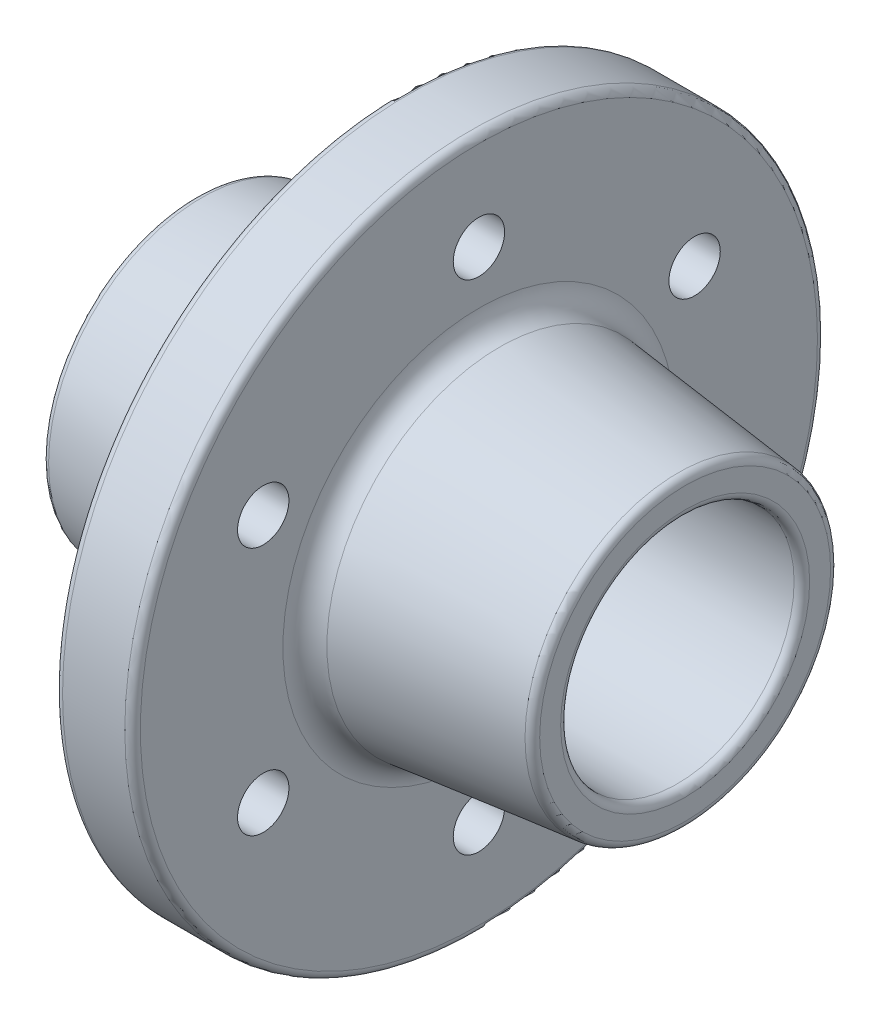
ISO-10303-21;
HEADER;
FILE_DESCRIPTION(('STEP AP214'),'2;1');
FILE_NAME('part.step','',(''),(''),'','','');
FILE_SCHEMA(('AUTOMOTIVE_DESIGN { 1 0 10303 214 1 1 1 1 }'));
ENDSEC;
DATA;
#1=APPLICATION_CONTEXT('core data for automotive mechanical design processes');
#2=APPLICATION_PROTOCOL_DEFINITION('international standard','automotive_design',2000,#1);
#3=PRODUCT_CONTEXT('',#1,'mechanical');
#4=PRODUCT('Part','Part','',(#3));
#5=PRODUCT_RELATED_PRODUCT_CATEGORY('part','',(#4));
#6=PRODUCT_DEFINITION_FORMATION('','',#4);
#7=PRODUCT_DEFINITION_CONTEXT('part definition',#1,'design');
#8=PRODUCT_DEFINITION('design','',#6,#7);
#9=PRODUCT_DEFINITION_SHAPE('','',#8);
#10=(LENGTH_UNIT() NAMED_UNIT(*) SI_UNIT(.MILLI.,.METRE.));
#11=(NAMED_UNIT(*) PLANE_ANGLE_UNIT() SI_UNIT($,.RADIAN.));
#12=(NAMED_UNIT(*) SI_UNIT($,.STERADIAN.) SOLID_ANGLE_UNIT());
#13=UNCERTAINTY_MEASURE_WITH_UNIT(LENGTH_MEASURE(1.E-05),#10,'distance_accuracy_value','');
#14=(GEOMETRIC_REPRESENTATION_CONTEXT(3) GLOBAL_UNCERTAINTY_ASSIGNED_CONTEXT((#13)) GLOBAL_UNIT_ASSIGNED_CONTEXT((#10,
#11,#12)) REPRESENTATION_CONTEXT('',''));
#15=CARTESIAN_POINT('',(0.,0.,0.));
#16=DIRECTION('',(0.,0.,1.));
#17=DIRECTION('',(1.,0.,0.));
#18=AXIS2_PLACEMENT_3D('',#15,#16,#17);
#19=CARTESIAN_POINT('',(0.,0.,0.));
#20=DIRECTION('',(1.,0.,0.));
#21=DIRECTION('',(0.,0.,-1.));
#22=AXIS2_PLACEMENT_3D('',#19,#20,#21);
#23=PLANE('',#22);
#24=CARTESIAN_POINT('',(0.,16.0000000000003,27.7128129211019));
#25=DIRECTION('',(-1.,0.,0.));
#26=DIRECTION('',(0.,0.,1.));
#27=AXIS2_PLACEMENT_3D('',#24,#25,#26);
#28=CIRCLE('',#27,3.29999999999999);
#29=CARTESIAN_POINT('',(0.,16.0000000000003,31.0128129211018));
#30=VERTEX_POINT('',#29);
#31=EDGE_CURVE('E93',#30,#30,#28,.T.);
#32=ORIENTED_EDGE('',*,*,#31,.F.);
#33=EDGE_LOOP('',(#32));
#34=FACE_BOUND('',#33,.T.);
#35=CARTESIAN_POINT('',(0.,-15.9999999999997,27.7128129211022));
#36=DIRECTION('',(-1.,0.,0.));
#37=DIRECTION('',(0.,0.,1.));
#38=AXIS2_PLACEMENT_3D('',#35,#36,#37);
#39=CIRCLE('',#38,3.29999999999999);
#40=CARTESIAN_POINT('',(0.,-15.9999999999997,31.0128129211022));
#41=VERTEX_POINT('',#40);
#42=EDGE_CURVE('E76',#41,#41,#39,.T.);
#43=ORIENTED_EDGE('',*,*,#42,.F.);
#44=EDGE_LOOP('',(#43));
#45=FACE_BOUND('',#44,.T.);
#46=CARTESIAN_POINT('',(0.,15.9999999999999,-27.7128129211021));
#47=DIRECTION('',(-1.,0.,0.));
#48=DIRECTION('',(0.,0.,1.));
#49=AXIS2_PLACEMENT_3D('',#46,#47,#48);
#50=CIRCLE('',#49,3.29999999999999);
#51=CARTESIAN_POINT('',(0.,15.9999999999999,-24.4128129211021));
#52=VERTEX_POINT('',#51);
#53=EDGE_CURVE('E103',#52,#52,#50,.T.);
#54=ORIENTED_EDGE('',*,*,#53,.F.);
#55=EDGE_LOOP('',(#54));
#56=FACE_BOUND('',#55,.T.);
#57=CARTESIAN_POINT('',(0.,32.,0.));
#58=DIRECTION('',(-1.,0.,0.));
#59=DIRECTION('',(0.,0.,1.));
#60=AXIS2_PLACEMENT_3D('',#57,#58,#59);
#61=CIRCLE('',#60,3.29999999999998);
#62=CARTESIAN_POINT('',(0.,32.,3.29999999999998));
#63=VERTEX_POINT('',#62);
#64=EDGE_CURVE('E111',#63,#63,#61,.T.);
#65=ORIENTED_EDGE('',*,*,#64,.F.);
#66=EDGE_LOOP('',(#65));
#67=FACE_BOUND('',#66,.T.);
#68=CARTESIAN_POINT('',(0.,0.,0.));
#69=DIRECTION('',(1.,0.,0.));
#70=DIRECTION('',(0.,0.,-1.));
#71=AXIS2_PLACEMENT_3D('',#68,#69,#70);
#72=CIRCLE('',#71,43.5);
#73=CARTESIAN_POINT('',(0.,0.,-43.5));
#74=VERTEX_POINT('',#73);
#75=EDGE_CURVE('E56',#74,#74,#72,.F.);
#76=ORIENTED_EDGE('',*,*,#75,.T.);
#77=EDGE_LOOP('',(#76));
#78=FACE_BOUND('',#77,.T.);
#79=CARTESIAN_POINT('',(0.,0.,0.));
#80=DIRECTION('',(1.,0.,0.));
#81=DIRECTION('',(0.,0.,-1.));
#82=AXIS2_PLACEMENT_3D('',#79,#80,#81);
#83=CIRCLE('',#82,25.1884399277633);
#84=CARTESIAN_POINT('',(0.,0.,-25.1884399277633));
#85=VERTEX_POINT('',#84);
#86=EDGE_CURVE('E131',#85,#85,#83,.T.);
#87=ORIENTED_EDGE('',*,*,#86,.T.);
#88=EDGE_LOOP('',(#87));
#89=FACE_BOUND('',#88,.T.);
#90=CARTESIAN_POINT('',(0.,-16.0000000000001,-27.712812921102));
#91=DIRECTION('',(-1.,0.,0.));
#92=DIRECTION('',(0.,0.,1.));
#93=AXIS2_PLACEMENT_3D('',#90,#91,#92);
#94=CIRCLE('',#93,3.29999999999999);
#95=CARTESIAN_POINT('',(0.,-16.0000000000001,-24.412812921102));
#96=VERTEX_POINT('',#95);
#97=EDGE_CURVE('E71',#96,#96,#94,.T.);
#98=ORIENTED_EDGE('',*,*,#97,.F.);
#99=EDGE_LOOP('',(#98));
#100=FACE_BOUND('',#99,.T.);
#101=CARTESIAN_POINT('',(0.,-32.,0.));
#102=DIRECTION('',(-1.,0.,0.));
#103=DIRECTION('',(0.,0.,1.));
#104=AXIS2_PLACEMENT_3D('',#101,#102,#103);
#105=CIRCLE('',#104,3.29999999999999);
#106=CARTESIAN_POINT('',(0.,-32.,3.29999999999999));
#107=VERTEX_POINT('',#106);
#108=EDGE_CURVE('E72',#107,#107,#105,.T.);
#109=ORIENTED_EDGE('',*,*,#108,.F.);
#110=EDGE_LOOP('',(#109));
#111=FACE_BOUND('',#110,.T.);
#112=ADVANCED_FACE('F47',(#34,#45,#56,#67,#78,#89,#100,#111),#23,.F.);
#113=CARTESIAN_POINT('',(10.,0.,0.));
#114=DIRECTION('',(-1.,0.,0.));
#115=DIRECTION('',(0.,0.,1.));
#116=AXIS2_PLACEMENT_3D('',#113,#114,#115);
#117=CYLINDRICAL_SURFACE('',#116,44.5);
#118=CARTESIAN_POINT('',(0.999999999999999,0.,0.));
#119=DIRECTION('',(1.,0.,0.));
#120=DIRECTION('',(0.,0.,-1.));
#121=AXIS2_PLACEMENT_3D('',#118,#119,#120);
#122=CIRCLE('',#121,44.5);
#123=CARTESIAN_POINT('',(0.999999999999999,0.,-44.5));
#124=VERTEX_POINT('',#123);
#125=EDGE_CURVE('E64',#124,#124,#122,.T.);
#126=ORIENTED_EDGE('',*,*,#125,.T.);
#127=EDGE_LOOP('',(#126));
#128=FACE_BOUND('',#127,.T.);
#129=CARTESIAN_POINT('',(9.,0.,0.));
#130=DIRECTION('',(1.,0.,0.));
#131=DIRECTION('',(0.,0.,-1.));
#132=AXIS2_PLACEMENT_3D('',#129,#130,#131);
#133=CIRCLE('',#132,44.5);
#134=CARTESIAN_POINT('',(9.,0.,-44.5));
#135=VERTEX_POINT('',#134);
#136=EDGE_CURVE('E167',#135,#135,#133,.F.);
#137=ORIENTED_EDGE('',*,*,#136,.T.);
#138=EDGE_LOOP('',(#137));
#139=FACE_BOUND('',#138,.T.);
#140=ADVANCED_FACE('F176',(#128,#139),#117,.T.);
#141=CARTESIAN_POINT('',(10.,0.,0.));
#142=DIRECTION('',(1.,0.,0.));
#143=DIRECTION('',(0.,0.,-1.));
#144=AXIS2_PLACEMENT_3D('',#141,#142,#143);
#145=PLANE('',#144);
#146=CARTESIAN_POINT('',(10.,16.0000000000003,27.7128129211019));
#147=DIRECTION('',(1.,0.,0.));
#148=DIRECTION('',(0.,0.,-1.));
#149=AXIS2_PLACEMENT_3D('',#146,#147,#148);
#150=CIRCLE('',#149,3.29999999999999);
#151=CARTESIAN_POINT('',(10.,16.0000000000003,24.4128129211019));
#152=VERTEX_POINT('',#151);
#153=EDGE_CURVE('E51',#152,#152,#150,.T.);
#154=ORIENTED_EDGE('',*,*,#153,.F.);
#155=EDGE_LOOP('',(#154));
#156=FACE_BOUND('',#155,.T.);
#157=CARTESIAN_POINT('',(10.,-15.9999999999997,27.7128129211022));
#158=DIRECTION('',(1.,0.,0.));
#159=DIRECTION('',(0.,0.,-1.));
#160=AXIS2_PLACEMENT_3D('',#157,#158,#159);
#161=CIRCLE('',#160,3.29999999999999);
#162=CARTESIAN_POINT('',(10.,-15.9999999999997,24.4128129211022));
#163=VERTEX_POINT('',#162);
#164=EDGE_CURVE('E73',#163,#163,#161,.T.);
#165=ORIENTED_EDGE('',*,*,#164,.F.);
#166=EDGE_LOOP('',(#165));
#167=FACE_BOUND('',#166,.T.);
#168=CARTESIAN_POINT('',(10.,-32.,0.));
#169=DIRECTION('',(1.,0.,0.));
#170=DIRECTION('',(0.,0.,-1.));
#171=AXIS2_PLACEMENT_3D('',#168,#169,#170);
#172=CIRCLE('',#171,3.29999999999999);
#173=CARTESIAN_POINT('',(10.,-32.,-3.29999999999999));
#174=VERTEX_POINT('',#173);
#175=EDGE_CURVE('E68',#174,#174,#172,.T.);
#176=ORIENTED_EDGE('',*,*,#175,.F.);
#177=EDGE_LOOP('',(#176));
#178=FACE_BOUND('',#177,.T.);
#179=CARTESIAN_POINT('',(10.,-16.0000000000001,-27.712812921102));
#180=DIRECTION('',(1.,0.,0.));
#181=DIRECTION('',(0.,0.,-1.));
#182=AXIS2_PLACEMENT_3D('',#179,#180,#181);
#183=CIRCLE('',#182,3.29999999999999);
#184=CARTESIAN_POINT('',(10.,-16.0000000000001,-31.012812921102));
#185=VERTEX_POINT('',#184);
#186=EDGE_CURVE('E99',#185,#185,#183,.T.);
#187=ORIENTED_EDGE('',*,*,#186,.F.);
#188=EDGE_LOOP('',(#187));
#189=FACE_BOUND('',#188,.T.);
#190=CARTESIAN_POINT('',(10.,15.9999999999999,-27.7128129211021));
#191=DIRECTION('',(1.,0.,0.));
#192=DIRECTION('',(0.,0.,-1.));
#193=AXIS2_PLACEMENT_3D('',#190,#191,#192);
#194=CIRCLE('',#193,3.29999999999999);
#195=CARTESIAN_POINT('',(10.,15.9999999999999,-31.0128129211021));
#196=VERTEX_POINT('',#195);
#197=EDGE_CURVE('E107',#196,#196,#194,.T.);
#198=ORIENTED_EDGE('',*,*,#197,.F.);
#199=EDGE_LOOP('',(#198));
#200=FACE_BOUND('',#199,.T.);
#201=CARTESIAN_POINT('',(10.,32.,0.));
#202=DIRECTION('',(1.,0.,0.));
#203=DIRECTION('',(0.,0.,-1.));
#204=AXIS2_PLACEMENT_3D('',#201,#202,#203);
#205=CIRCLE('',#204,3.29999999999999);
#206=CARTESIAN_POINT('',(10.,32.,-3.29999999999999));
#207=VERTEX_POINT('',#206);
#208=EDGE_CURVE('E115',#207,#207,#205,.T.);
#209=ORIENTED_EDGE('',*,*,#208,.F.);
#210=EDGE_LOOP('',(#209));
#211=FACE_BOUND('',#210,.T.);
#212=CARTESIAN_POINT('',(10.,0.,0.));
#213=DIRECTION('',(1.,0.,0.));
#214=DIRECTION('',(0.,0.,-1.));
#215=AXIS2_PLACEMENT_3D('',#212,#213,#214);
#216=CIRCLE('',#215,43.5);
#217=CARTESIAN_POINT('',(10.,0.,-43.5));
#218=VERTEX_POINT('',#217);
#219=EDGE_CURVE('E10',#218,#218,#216,.T.);
#220=ORIENTED_EDGE('',*,*,#219,.T.);
#221=EDGE_LOOP('',(#220));
#222=FACE_BOUND('',#221,.T.);
#223=CARTESIAN_POINT('',(10.,0.,0.));
#224=DIRECTION('',(1.,0.,0.));
#225=DIRECTION('',(0.,0.,-1.));
#226=AXIS2_PLACEMENT_3D('',#223,#224,#225);
#227=CIRCLE('',#226,25.1884399277633);
#228=CARTESIAN_POINT('',(10.,0.,-25.1884399277633));
#229=VERTEX_POINT('',#228);
#230=EDGE_CURVE('E123',#229,#229,#227,.F.);
#231=ORIENTED_EDGE('',*,*,#230,.T.);
#232=EDGE_LOOP('',(#231));
#233=FACE_BOUND('',#232,.T.);
#234=ADVANCED_FACE('F199',(#156,#167,#178,#189,#200,#211,#222,#233),#145,.T.);
#235=CARTESIAN_POINT('',(0.,0.,0.));
#236=DIRECTION('',(1.,0.,0.));
#237=DIRECTION('',(0.,0.,1.));
#238=AXIS2_PLACEMENT_3D('',#235,#236,#237);
#239=CONICAL_SURFACE('',#238,22.5,0.109432144100045);
#240=CARTESIAN_POINT('',(-25.6092138593334,0.,0.));
#241=DIRECTION('',(1.,0.,0.));
#242=DIRECTION('',(0.,0.,-1.));
#243=AXIS2_PLACEMENT_3D('',#240,#241,#242);
#244=CIRCLE('',#243,19.6862880716254);
#245=CARTESIAN_POINT('',(-25.6092138593334,0.,-19.6862880716254));
#246=VERTEX_POINT('',#245);
#247=EDGE_CURVE('E163',#246,#246,#244,.T.);
#248=ORIENTED_EDGE('',*,*,#247,.T.);
#249=EDGE_LOOP('',(#248));
#250=FACE_BOUND('',#249,.T.);
#251=CARTESIAN_POINT('',(-2.67235842199976,0.,0.));
#252=DIRECTION('',(1.,0.,0.));
#253=DIRECTION('',(0.,0.,-1.));
#254=AXIS2_PLACEMENT_3D('',#251,#252,#253);
#255=CIRCLE('',#254,22.2063850999029);
#256=CARTESIAN_POINT('',(-2.67235842199976,0.,-22.2063850999029));
#257=VERTEX_POINT('',#256);
#258=EDGE_CURVE('E127',#257,#257,#255,.F.);
#259=ORIENTED_EDGE('',*,*,#258,.T.);
#260=EDGE_LOOP('',(#259));
#261=FACE_BOUND('',#260,.T.);
#262=ADVANCED_FACE('F236',(#250,#261),#239,.T.);
#263=CARTESIAN_POINT('',(-26.5,0.,0.));
#264=DIRECTION('',(-1.,0.,0.));
#265=DIRECTION('',(0.,0.,1.));
#266=AXIS2_PLACEMENT_3D('',#263,#264,#265);
#267=PLANE('',#266);
#268=CARTESIAN_POINT('',(-26.5,0.,0.));
#269=DIRECTION('',(-1.,0.,0.));
#270=DIRECTION('',(0.,0.,1.));
#271=AXIS2_PLACEMENT_3D('',#268,#269,#270);
#272=CIRCLE('',#271,16.);
#273=CARTESIAN_POINT('',(-26.5,0.,16.));
#274=VERTEX_POINT('',#273);
#275=EDGE_CURVE('E155',#274,#274,#272,.F.);
#276=ORIENTED_EDGE('',*,*,#275,.T.);
#277=EDGE_LOOP('',(#276));
#278=FACE_BOUND('',#277,.T.);
#279=CARTESIAN_POINT('',(-26.5,0.,0.));
#280=DIRECTION('',(-1.,0.,0.));
#281=DIRECTION('',(0.,0.,1.));
#282=AXIS2_PLACEMENT_3D('',#279,#280,#281);
#283=CIRCLE('',#282,18.692269795672);
#284=CARTESIAN_POINT('',(-26.5,0.,18.692269795672));
#285=VERTEX_POINT('',#284);
#286=EDGE_CURVE('E151',#285,#285,#283,.T.);
#287=ORIENTED_EDGE('',*,*,#286,.T.);
#288=EDGE_LOOP('',(#287));
#289=FACE_BOUND('',#288,.T.);
#290=ADVANCED_FACE('F232',(#278,#289),#267,.T.);
#291=CARTESIAN_POINT('',(10.,0.,0.));
#292=DIRECTION('',(-1.,0.,0.));
#293=DIRECTION('',(0.,0.,-1.));
#294=AXIS2_PLACEMENT_3D('',#291,#292,#293);
#295=CONICAL_SURFACE('',#294,22.5,0.109432144100045);
#296=CARTESIAN_POINT('',(35.6092138593334,0.,0.));
#297=DIRECTION('',(-1.,0.,0.));
#298=DIRECTION('',(0.,0.,1.));
#299=AXIS2_PLACEMENT_3D('',#296,#297,#298);
#300=CIRCLE('',#299,19.6862880716254);
#301=CARTESIAN_POINT('',(35.6092138593334,0.,19.6862880716254));
#302=VERTEX_POINT('',#301);
#303=EDGE_CURVE('E147',#302,#302,#300,.T.);
#304=ORIENTED_EDGE('',*,*,#303,.T.);
#305=EDGE_LOOP('',(#304));
#306=FACE_BOUND('',#305,.T.);
#307=CARTESIAN_POINT('',(12.6723584219998,0.,0.));
#308=DIRECTION('',(1.,0.,0.));
#309=DIRECTION('',(0.,0.,-1.));
#310=AXIS2_PLACEMENT_3D('',#307,#308,#309);
#311=CIRCLE('',#310,22.2063850999029);
#312=CARTESIAN_POINT('',(12.6723584219998,0.,-22.2063850999029));
#313=VERTEX_POINT('',#312);
#314=EDGE_CURVE('E119',#313,#313,#311,.T.);
#315=ORIENTED_EDGE('',*,*,#314,.T.);
#316=EDGE_LOOP('',(#315));
#317=FACE_BOUND('',#316,.T.);
#318=ADVANCED_FACE('F235',(#306,#317),#295,.T.);
#319=CARTESIAN_POINT('',(36.5,0.,0.));
#320=DIRECTION('',(1.,0.,0.));
#321=DIRECTION('',(0.,0.,-1.));
#322=AXIS2_PLACEMENT_3D('',#319,#320,#321);
#323=PLANE('',#322);
#324=CARTESIAN_POINT('',(36.5,0.,0.));
#325=DIRECTION('',(1.,0.,0.));
#326=DIRECTION('',(0.,0.,-1.));
#327=AXIS2_PLACEMENT_3D('',#324,#325,#326);
#328=CIRCLE('',#327,16.);
#329=CARTESIAN_POINT('',(36.5,0.,-16.));
#330=VERTEX_POINT('',#329);
#331=EDGE_CURVE('E143',#330,#330,#328,.F.);
#332=ORIENTED_EDGE('',*,*,#331,.T.);
#333=EDGE_LOOP('',(#332));
#334=FACE_BOUND('',#333,.T.);
#335=CARTESIAN_POINT('',(36.5,0.,0.));
#336=DIRECTION('',(1.,0.,0.));
#337=DIRECTION('',(0.,0.,-1.));
#338=AXIS2_PLACEMENT_3D('',#335,#336,#337);
#339=CIRCLE('',#338,18.692269795672);
#340=CARTESIAN_POINT('',(36.5,0.,-18.692269795672));
#341=VERTEX_POINT('',#340);
#342=EDGE_CURVE('E139',#341,#341,#339,.T.);
#343=ORIENTED_EDGE('',*,*,#342,.T.);
#344=EDGE_LOOP('',(#343));
#345=FACE_BOUND('',#344,.T.);
#346=ADVANCED_FACE('F210',(#334,#345),#323,.T.);
#347=CARTESIAN_POINT('',(13.,0.,0.));
#348=DIRECTION('',(1.,0.,0.));
#349=DIRECTION('',(0.,0.,-1.));
#350=AXIS2_PLACEMENT_3D('',#347,#348,#349);
#351=TOROIDAL_SURFACE('',#350,25.1884399277633,3.);
#352=ORIENTED_EDGE('',*,*,#230,.F.);
#353=EDGE_LOOP('',(#352));
#354=FACE_BOUND('',#353,.T.);
#355=ORIENTED_EDGE('',*,*,#314,.F.);
#356=EDGE_LOOP('',(#355));
#357=FACE_BOUND('',#356,.T.);
#358=ADVANCED_FACE('F206',(#354,#357),#351,.F.);
#359=CARTESIAN_POINT('',(-3.,0.,0.));
#360=DIRECTION('',(1.,0.,0.));
#361=DIRECTION('',(0.,0.,-1.));
#362=AXIS2_PLACEMENT_3D('',#359,#360,#361);
#363=TOROIDAL_SURFACE('',#362,25.1884399277633,3.);
#364=ORIENTED_EDGE('',*,*,#86,.F.);
#365=EDGE_LOOP('',(#364));
#366=FACE_BOUND('',#365,.T.);
#367=ORIENTED_EDGE('',*,*,#258,.F.);
#368=EDGE_LOOP('',(#367));
#369=FACE_BOUND('',#368,.T.);
#370=ADVANCED_FACE('F209',(#366,#369),#363,.F.);
#371=CARTESIAN_POINT('',(-26.5,0.,0.));
#372=DIRECTION('',(1.,0.,0.));
#373=DIRECTION('',(0.,0.,-1.));
#374=AXIS2_PLACEMENT_3D('',#371,#372,#373);
#375=CYLINDRICAL_SURFACE('',#374,15.);
#376=CARTESIAN_POINT('',(-25.5,0.,0.));
#377=DIRECTION('',(-1.,0.,0.));
#378=DIRECTION('',(0.,0.,1.));
#379=AXIS2_PLACEMENT_3D('',#376,#377,#378);
#380=CIRCLE('',#379,15.);
#381=CARTESIAN_POINT('',(-25.5,0.,15.));
#382=VERTEX_POINT('',#381);
#383=EDGE_CURVE('E159',#382,#382,#380,.T.);
#384=ORIENTED_EDGE('',*,*,#383,.T.);
#385=EDGE_LOOP('',(#384));
#386=FACE_BOUND('',#385,.T.);
#387=CARTESIAN_POINT('',(35.5,0.,0.));
#388=DIRECTION('',(1.,0.,0.));
#389=DIRECTION('',(0.,0.,-1.));
#390=AXIS2_PLACEMENT_3D('',#387,#388,#389);
#391=CIRCLE('',#390,15.);
#392=CARTESIAN_POINT('',(35.5,0.,-15.));
#393=VERTEX_POINT('',#392);
#394=EDGE_CURVE('E135',#393,#393,#391,.T.);
#395=ORIENTED_EDGE('',*,*,#394,.T.);
#396=EDGE_LOOP('',(#395));
#397=FACE_BOUND('',#396,.T.);
#398=ADVANCED_FACE('F214',(#386,#397),#375,.F.);
#399=CARTESIAN_POINT('',(35.5,0.,0.));
#400=DIRECTION('',(1.,0.,0.));
#401=DIRECTION('',(0.,0.,-1.));
#402=AXIS2_PLACEMENT_3D('',#399,#400,#401);
#403=TOROIDAL_SURFACE('',#402,16.,1.);
#404=ORIENTED_EDGE('',*,*,#331,.F.);
#405=EDGE_LOOP('',(#404));
#406=FACE_BOUND('',#405,.T.);
#407=ORIENTED_EDGE('',*,*,#394,.F.);
#408=EDGE_LOOP('',(#407));
#409=FACE_BOUND('',#408,.T.);
#410=ADVANCED_FACE('F216',(#406,#409),#403,.T.);
#411=CARTESIAN_POINT('',(35.5,0.,0.));
#412=DIRECTION('',(1.,0.,0.));
#413=DIRECTION('',(0.,0.,-1.));
#414=AXIS2_PLACEMENT_3D('',#411,#412,#413);
#415=TOROIDAL_SURFACE('',#414,18.692269795672,1.);
#416=ORIENTED_EDGE('',*,*,#303,.F.);
#417=EDGE_LOOP('',(#416));
#418=FACE_BOUND('',#417,.T.);
#419=ORIENTED_EDGE('',*,*,#342,.F.);
#420=EDGE_LOOP('',(#419));
#421=FACE_BOUND('',#420,.T.);
#422=ADVANCED_FACE('F219',(#418,#421),#415,.T.);
#423=CARTESIAN_POINT('',(-25.5,0.,0.));
#424=DIRECTION('',(-1.,0.,0.));
#425=DIRECTION('',(0.,0.,1.));
#426=AXIS2_PLACEMENT_3D('',#423,#424,#425);
#427=TOROIDAL_SURFACE('',#426,16.,1.);
#428=ORIENTED_EDGE('',*,*,#383,.F.);
#429=EDGE_LOOP('',(#428));
#430=FACE_BOUND('',#429,.T.);
#431=ORIENTED_EDGE('',*,*,#275,.F.);
#432=EDGE_LOOP('',(#431));
#433=FACE_BOUND('',#432,.T.);
#434=ADVANCED_FACE('F189',(#430,#433),#427,.T.);
#435=CARTESIAN_POINT('',(-25.5,0.,0.));
#436=DIRECTION('',(-1.,0.,0.));
#437=DIRECTION('',(0.,0.,1.));
#438=AXIS2_PLACEMENT_3D('',#435,#436,#437);
#439=TOROIDAL_SURFACE('',#438,18.692269795672,1.);
#440=ORIENTED_EDGE('',*,*,#247,.F.);
#441=EDGE_LOOP('',(#440));
#442=FACE_BOUND('',#441,.T.);
#443=ORIENTED_EDGE('',*,*,#286,.F.);
#444=EDGE_LOOP('',(#443));
#445=FACE_BOUND('',#444,.T.);
#446=ADVANCED_FACE('F181',(#442,#445),#439,.T.);
#447=CARTESIAN_POINT('',(0.999999999999999,0.,0.));
#448=DIRECTION('',(1.,0.,0.));
#449=DIRECTION('',(0.,0.,-1.));
#450=AXIS2_PLACEMENT_3D('',#447,#448,#449);
#451=TOROIDAL_SURFACE('',#450,43.5,1.);
#452=ORIENTED_EDGE('',*,*,#75,.F.);
#453=EDGE_LOOP('',(#452));
#454=FACE_BOUND('',#453,.T.);
#455=ORIENTED_EDGE('',*,*,#125,.F.);
#456=EDGE_LOOP('',(#455));
#457=FACE_BOUND('',#456,.T.);
#458=ADVANCED_FACE('F179',(#454,#457),#451,.T.);
#459=CARTESIAN_POINT('',(9.,0.,0.));
#460=DIRECTION('',(1.,0.,0.));
#461=DIRECTION('',(0.,0.,-1.));
#462=AXIS2_PLACEMENT_3D('',#459,#460,#461);
#463=TOROIDAL_SURFACE('',#462,43.5,1.);
#464=ORIENTED_EDGE('',*,*,#136,.F.);
#465=EDGE_LOOP('',(#464));
#466=FACE_BOUND('',#465,.T.);
#467=ORIENTED_EDGE('',*,*,#219,.F.);
#468=EDGE_LOOP('',(#467));
#469=FACE_BOUND('',#468,.T.);
#470=ADVANCED_FACE('F49',(#466,#469),#463,.T.);
#471=CARTESIAN_POINT('',(0.,32.,0.));
#472=DIRECTION('',(-1.,0.,0.));
#473=DIRECTION('',(0.,0.,1.));
#474=AXIS2_PLACEMENT_3D('',#471,#472,#473);
#475=CYLINDRICAL_SURFACE('',#474,3.29999999999999);
#476=ORIENTED_EDGE('',*,*,#208,.T.);
#477=EDGE_LOOP('',(#476));
#478=FACE_BOUND('',#477,.T.);
#479=ORIENTED_EDGE('',*,*,#64,.T.);
#480=EDGE_LOOP('',(#479));
#481=FACE_BOUND('',#480,.T.);
#482=ADVANCED_FACE('F187',(#478,#481),#475,.F.);
#483=CARTESIAN_POINT('',(0.,15.9999999999999,-27.7128129211021));
#484=DIRECTION('',(-1.,0.,0.));
#485=DIRECTION('',(0.,0.,1.));
#486=AXIS2_PLACEMENT_3D('',#483,#484,#485);
#487=CYLINDRICAL_SURFACE('',#486,3.29999999999999);
#488=ORIENTED_EDGE('',*,*,#197,.T.);
#489=EDGE_LOOP('',(#488));
#490=FACE_BOUND('',#489,.T.);
#491=ORIENTED_EDGE('',*,*,#53,.T.);
#492=EDGE_LOOP('',(#491));
#493=FACE_BOUND('',#492,.T.);
#494=ADVANCED_FACE('F256',(#490,#493),#487,.F.);
#495=CARTESIAN_POINT('',(0.,-16.0000000000001,-27.712812921102));
#496=DIRECTION('',(-1.,0.,0.));
#497=DIRECTION('',(0.,0.,1.));
#498=AXIS2_PLACEMENT_3D('',#495,#496,#497);
#499=CYLINDRICAL_SURFACE('',#498,3.29999999999999);
#500=ORIENTED_EDGE('',*,*,#186,.T.);
#501=EDGE_LOOP('',(#500));
#502=FACE_BOUND('',#501,.T.);
#503=ORIENTED_EDGE('',*,*,#97,.T.);
#504=EDGE_LOOP('',(#503));
#505=FACE_BOUND('',#504,.T.);
#506=ADVANCED_FACE('F260',(#502,#505),#499,.F.);
#507=CARTESIAN_POINT('',(0.,-32.,0.));
#508=DIRECTION('',(-1.,0.,0.));
#509=DIRECTION('',(0.,0.,1.));
#510=AXIS2_PLACEMENT_3D('',#507,#508,#509);
#511=CYLINDRICAL_SURFACE('',#510,3.29999999999999);
#512=ORIENTED_EDGE('',*,*,#175,.T.);
#513=EDGE_LOOP('',(#512));
#514=FACE_BOUND('',#513,.T.);
#515=ORIENTED_EDGE('',*,*,#108,.T.);
#516=EDGE_LOOP('',(#515));
#517=FACE_BOUND('',#516,.T.);
#518=ADVANCED_FACE('F264',(#514,#517),#511,.F.);
#519=CARTESIAN_POINT('',(0.,-15.9999999999997,27.7128129211022));
#520=DIRECTION('',(-1.,0.,0.));
#521=DIRECTION('',(0.,0.,1.));
#522=AXIS2_PLACEMENT_3D('',#519,#520,#521);
#523=CYLINDRICAL_SURFACE('',#522,3.29999999999999);
#524=ORIENTED_EDGE('',*,*,#164,.T.);
#525=EDGE_LOOP('',(#524));
#526=FACE_BOUND('',#525,.T.);
#527=ORIENTED_EDGE('',*,*,#42,.T.);
#528=EDGE_LOOP('',(#527));
#529=FACE_BOUND('',#528,.T.);
#530=ADVANCED_FACE('F268',(#526,#529),#523,.F.);
#531=CARTESIAN_POINT('',(0.,16.0000000000003,27.7128129211019));
#532=DIRECTION('',(-1.,0.,0.));
#533=DIRECTION('',(0.,0.,1.));
#534=AXIS2_PLACEMENT_3D('',#531,#532,#533);
#535=CYLINDRICAL_SURFACE('',#534,3.29999999999999);
#536=ORIENTED_EDGE('',*,*,#153,.T.);
#537=EDGE_LOOP('',(#536));
#538=FACE_BOUND('',#537,.T.);
#539=ORIENTED_EDGE('',*,*,#31,.T.);
#540=EDGE_LOOP('',(#539));
#541=FACE_BOUND('',#540,.T.);
#542=ADVANCED_FACE('F272',(#538,#541),#535,.F.);
#543=CLOSED_SHELL('',(#112,#140,#234,#262,#290,#318,#346,#358,#370,#398,#410,#422,#434,#446,
#458,#470,#482,#494,#506,#518,#530,#542));
#544=MANIFOLD_SOLID_BREP('B2',#543);
#545=ADVANCED_BREP_SHAPE_REPRESENTATION('',(#18,#544),#14);
#546=SHAPE_DEFINITION_REPRESENTATION(#9,#545);
ENDSEC;
END-ISO-10303-21;
